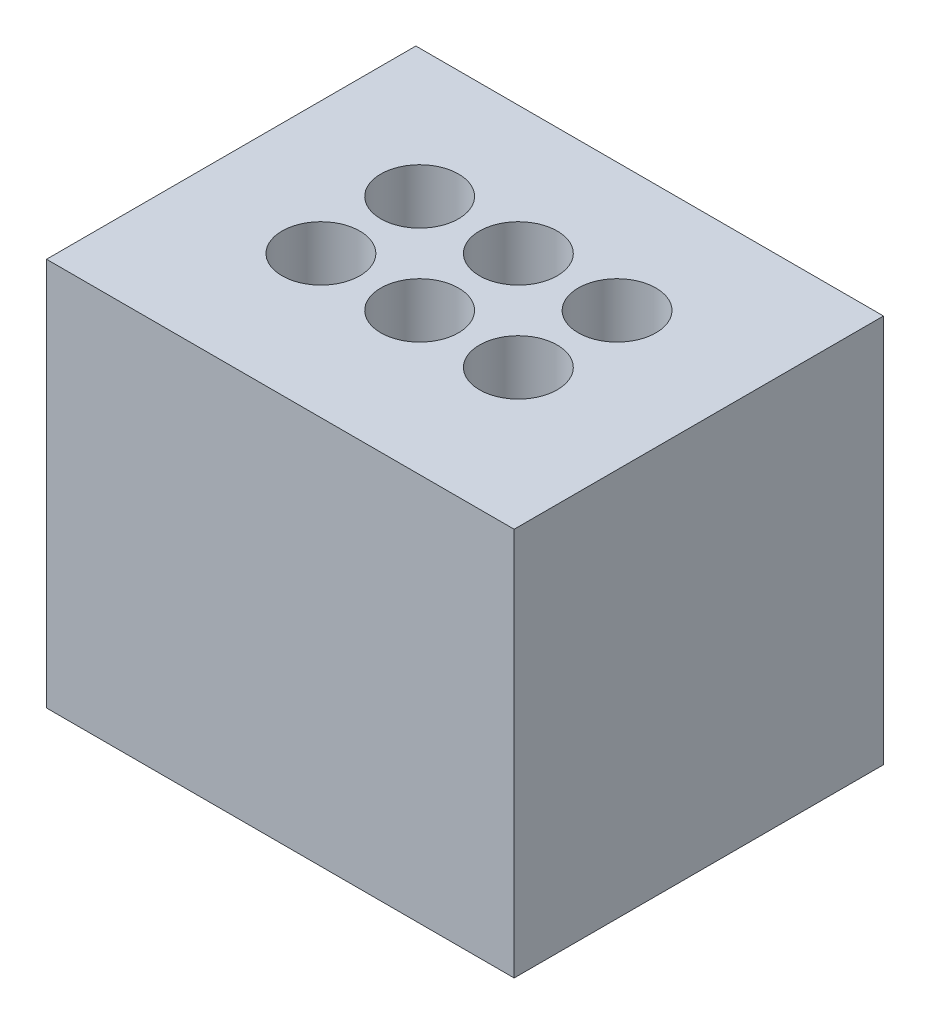
ISO-10303-21;
HEADER;
FILE_DESCRIPTION(('STEP AP214'),'2;1');
FILE_NAME('part.step','',(''),(''),'','','');
FILE_SCHEMA(('AUTOMOTIVE_DESIGN { 1 0 10303 214 1 1 1 1 }'));
ENDSEC;
DATA;
#1=APPLICATION_CONTEXT('core data for automotive mechanical design processes');
#2=APPLICATION_PROTOCOL_DEFINITION('international standard','automotive_design',2000,#1);
#3=PRODUCT_CONTEXT('',#1,'mechanical');
#4=PRODUCT('Part','Part','',(#3));
#5=PRODUCT_RELATED_PRODUCT_CATEGORY('part','',(#4));
#6=PRODUCT_DEFINITION_FORMATION('','',#4);
#7=PRODUCT_DEFINITION_CONTEXT('part definition',#1,'design');
#8=PRODUCT_DEFINITION('design','',#6,#7);
#9=PRODUCT_DEFINITION_SHAPE('','',#8);
#10=(LENGTH_UNIT() NAMED_UNIT(*) SI_UNIT(.MILLI.,.METRE.));
#11=(NAMED_UNIT(*) PLANE_ANGLE_UNIT() SI_UNIT($,.RADIAN.));
#12=(NAMED_UNIT(*) SI_UNIT($,.STERADIAN.) SOLID_ANGLE_UNIT());
#13=UNCERTAINTY_MEASURE_WITH_UNIT(LENGTH_MEASURE(1.E-05),#10,'distance_accuracy_value','');
#14=(GEOMETRIC_REPRESENTATION_CONTEXT(3) GLOBAL_UNCERTAINTY_ASSIGNED_CONTEXT((#13)) GLOBAL_UNIT_ASSIGNED_CONTEXT((#10,
#11,#12)) REPRESENTATION_CONTEXT('',''));
#15=CARTESIAN_POINT('',(0.,0.,0.));
#16=DIRECTION('',(0.,0.,1.));
#17=DIRECTION('',(1.,0.,0.));
#18=AXIS2_PLACEMENT_3D('',#15,#16,#17);
#19=CARTESIAN_POINT('',(0.,10.,0.));
#20=DIRECTION('',(0.,1.,0.));
#21=DIRECTION('',(0.,0.,1.));
#22=AXIS2_PLACEMENT_3D('',#19,#20,#21);
#23=PLANE('',#22);
#24=CARTESIAN_POINT('',(17.8208556768669,10.,-12.9265911009987));
#25=DIRECTION('',(0.,1.,0.));
#26=DIRECTION('',(0.,0.,1.));
#27=AXIS2_PLACEMENT_3D('',#24,#25,#26);
#28=CIRCLE('',#27,1.);
#29=CARTESIAN_POINT('',(17.8208556768669,10.,-11.9265911009987));
#30=VERTEX_POINT('',#29);
#31=EDGE_CURVE('E133',#30,#30,#28,.T.);
#32=ORIENTED_EDGE('',*,*,#31,.F.);
#33=EDGE_LOOP('',(#32));
#34=FACE_BOUND('',#33,.T.);
#35=CARTESIAN_POINT('',(20.360855676867,10.,-10.3865911009987));
#36=DIRECTION('',(0.,1.,0.));
#37=DIRECTION('',(0.,0.,1.));
#38=AXIS2_PLACEMENT_3D('',#35,#36,#37);
#39=CIRCLE('',#38,1.);
#40=CARTESIAN_POINT('',(20.360855676867,10.,-9.38659110099869));
#41=VERTEX_POINT('',#40);
#42=EDGE_CURVE('E121',#41,#41,#39,.T.);
#43=ORIENTED_EDGE('',*,*,#42,.F.);
#44=EDGE_LOOP('',(#43));
#45=FACE_BOUND('',#44,.T.);
#46=CARTESIAN_POINT('',(15.280855676867,10.,-10.3865911009987));
#47=DIRECTION('',(0.,1.,0.));
#48=DIRECTION('',(0.,0.,1.));
#49=AXIS2_PLACEMENT_3D('',#46,#47,#48);
#50=CIRCLE('',#49,1.);
#51=CARTESIAN_POINT('',(15.280855676867,10.,-9.38659110099869));
#52=VERTEX_POINT('',#51);
#53=EDGE_CURVE('E100',#52,#52,#50,.T.);
#54=ORIENTED_EDGE('',*,*,#53,.F.);
#55=EDGE_LOOP('',(#54));
#56=FACE_BOUND('',#55,.T.);
#57=DIRECTION('',(0.,0.,1.));
#58=VECTOR('',#57,1.);
#59=CARTESIAN_POINT('',(11.8802985663251,10.,-16.229676856771));
#60=LINE('',#59,#58);
#61=CARTESIAN_POINT('',(11.8802985663251,10.,-16.229676856771));
#62=VERTEX_POINT('',#61);
#63=CARTESIAN_POINT('',(11.8802985663251,10.,-6.72663628694349));
#64=VERTEX_POINT('',#63);
#65=EDGE_CURVE('E85',#62,#64,#60,.T.);
#66=ORIENTED_EDGE('',*,*,#65,.T.);
#67=DIRECTION('',(1.,0.,0.));
#68=VECTOR('',#67,1.);
#69=CARTESIAN_POINT('',(11.8802985663251,10.,-6.72663628694349));
#70=LINE('',#69,#68);
#71=CARTESIAN_POINT('',(23.9122387646944,10.,-6.72663628694349));
#72=VERTEX_POINT('',#71);
#73=EDGE_CURVE('E80',#64,#72,#70,.T.);
#74=ORIENTED_EDGE('',*,*,#73,.T.);
#75=DIRECTION('',(0.,0.,-1.));
#76=VECTOR('',#75,1.);
#77=CARTESIAN_POINT('',(23.9122387646944,10.,-16.229676856771));
#78=LINE('',#77,#76);
#79=CARTESIAN_POINT('',(23.9122387646944,10.,-16.229676856771));
#80=VERTEX_POINT('',#79);
#81=EDGE_CURVE('E83',#72,#80,#78,.T.);
#82=ORIENTED_EDGE('',*,*,#81,.T.);
#83=DIRECTION('',(-1.,0.,0.));
#84=VECTOR('',#83,1.);
#85=CARTESIAN_POINT('',(11.8802985663251,10.,-16.229676856771));
#86=LINE('',#85,#84);
#87=EDGE_CURVE('E50',#80,#62,#86,.T.);
#88=ORIENTED_EDGE('',*,*,#87,.T.);
#89=EDGE_LOOP('',(#66,#74,#82,#88));
#90=FACE_BOUND('',#89,.T.);
#91=CARTESIAN_POINT('',(17.820855676867,10.,-10.3865911009987));
#92=DIRECTION('',(0.,1.,0.));
#93=DIRECTION('',(0.,0.,1.));
#94=AXIS2_PLACEMENT_3D('',#91,#92,#93);
#95=CIRCLE('',#94,1.);
#96=CARTESIAN_POINT('',(17.820855676867,10.,-9.38659110099869));
#97=VERTEX_POINT('',#96);
#98=EDGE_CURVE('E115',#97,#97,#95,.T.);
#99=ORIENTED_EDGE('',*,*,#98,.F.);
#100=EDGE_LOOP('',(#99));
#101=FACE_BOUND('',#100,.T.);
#102=CARTESIAN_POINT('',(15.2808556768669,10.,-12.9265911009987));
#103=DIRECTION('',(0.,1.,0.));
#104=DIRECTION('',(0.,0.,1.));
#105=AXIS2_PLACEMENT_3D('',#102,#103,#104);
#106=CIRCLE('',#105,1.);
#107=CARTESIAN_POINT('',(15.2808556768669,10.,-11.9265911009987));
#108=VERTEX_POINT('',#107);
#109=EDGE_CURVE('E127',#108,#108,#106,.T.);
#110=ORIENTED_EDGE('',*,*,#109,.F.);
#111=EDGE_LOOP('',(#110));
#112=FACE_BOUND('',#111,.T.);
#113=CARTESIAN_POINT('',(20.3608556768669,10.,-12.9265911009987));
#114=DIRECTION('',(0.,1.,0.));
#115=DIRECTION('',(0.,0.,1.));
#116=AXIS2_PLACEMENT_3D('',#113,#114,#115);
#117=CIRCLE('',#116,1.);
#118=CARTESIAN_POINT('',(20.3608556768669,10.,-11.9265911009987));
#119=VERTEX_POINT('',#118);
#120=EDGE_CURVE('E139',#119,#119,#117,.T.);
#121=ORIENTED_EDGE('',*,*,#120,.F.);
#122=EDGE_LOOP('',(#121));
#123=FACE_BOUND('',#122,.T.);
#124=ADVANCED_FACE('F33',(#34,#45,#56,#90,#101,#112,#123),#23,.T.);
#125=CARTESIAN_POINT('',(0.,0.,0.));
#126=DIRECTION('',(0.,1.,0.));
#127=DIRECTION('',(0.,0.,1.));
#128=AXIS2_PLACEMENT_3D('',#125,#126,#127);
#129=PLANE('',#128);
#130=DIRECTION('',(0.,0.,1.));
#131=VECTOR('',#130,1.);
#132=CARTESIAN_POINT('',(11.8802985663251,0.,-16.229676856771));
#133=LINE('',#132,#131);
#134=CARTESIAN_POINT('',(11.8802985663251,0.,-16.229676856771));
#135=VERTEX_POINT('',#134);
#136=CARTESIAN_POINT('',(11.8802985663251,0.,-6.72663628694349));
#137=VERTEX_POINT('',#136);
#138=EDGE_CURVE('E97',#135,#137,#133,.T.);
#139=ORIENTED_EDGE('',*,*,#138,.F.);
#140=DIRECTION('',(-1.,0.,0.));
#141=VECTOR('',#140,1.);
#142=CARTESIAN_POINT('',(11.8802985663251,0.,-16.229676856771));
#143=LINE('',#142,#141);
#144=CARTESIAN_POINT('',(23.9122387646944,0.,-16.229676856771));
#145=VERTEX_POINT('',#144);
#146=EDGE_CURVE('E73',#145,#135,#143,.T.);
#147=ORIENTED_EDGE('',*,*,#146,.F.);
#148=DIRECTION('',(0.,0.,-1.));
#149=VECTOR('',#148,1.);
#150=CARTESIAN_POINT('',(23.9122387646944,0.,-16.229676856771));
#151=LINE('',#150,#149);
#152=CARTESIAN_POINT('',(23.9122387646944,0.,-6.72663628694349));
#153=VERTEX_POINT('',#152);
#154=EDGE_CURVE('E67',#153,#145,#151,.T.);
#155=ORIENTED_EDGE('',*,*,#154,.F.);
#156=DIRECTION('',(1.,0.,0.));
#157=VECTOR('',#156,1.);
#158=CARTESIAN_POINT('',(11.8802985663251,0.,-6.72663628694349));
#159=LINE('',#158,#157);
#160=EDGE_CURVE('E89',#137,#153,#159,.T.);
#161=ORIENTED_EDGE('',*,*,#160,.F.);
#162=EDGE_LOOP('',(#139,#147,#155,#161));
#163=FACE_BOUND('',#162,.T.);
#164=CARTESIAN_POINT('',(15.280855676867,0.,-10.3865911009987));
#165=DIRECTION('',(0.,1.,0.));
#166=DIRECTION('',(0.,0.,1.));
#167=AXIS2_PLACEMENT_3D('',#164,#165,#166);
#168=CIRCLE('',#167,1.);
#169=CARTESIAN_POINT('',(15.280855676867,0.,-9.38659110099869));
#170=VERTEX_POINT('',#169);
#171=EDGE_CURVE('E112',#170,#170,#168,.T.);
#172=ORIENTED_EDGE('',*,*,#171,.T.);
#173=EDGE_LOOP('',(#172));
#174=FACE_BOUND('',#173,.T.);
#175=CARTESIAN_POINT('',(17.820855676867,0.,-10.3865911009987));
#176=DIRECTION('',(0.,1.,0.));
#177=DIRECTION('',(0.,0.,1.));
#178=AXIS2_PLACEMENT_3D('',#175,#176,#177);
#179=CIRCLE('',#178,1.);
#180=CARTESIAN_POINT('',(17.820855676867,0.,-9.38659110099869));
#181=VERTEX_POINT('',#180);
#182=EDGE_CURVE('E118',#181,#181,#179,.T.);
#183=ORIENTED_EDGE('',*,*,#182,.T.);
#184=EDGE_LOOP('',(#183));
#185=FACE_BOUND('',#184,.T.);
#186=CARTESIAN_POINT('',(20.360855676867,0.,-10.3865911009987));
#187=DIRECTION('',(0.,1.,0.));
#188=DIRECTION('',(0.,0.,1.));
#189=AXIS2_PLACEMENT_3D('',#186,#187,#188);
#190=CIRCLE('',#189,1.);
#191=CARTESIAN_POINT('',(20.360855676867,0.,-9.38659110099869));
#192=VERTEX_POINT('',#191);
#193=EDGE_CURVE('E124',#192,#192,#190,.T.);
#194=ORIENTED_EDGE('',*,*,#193,.T.);
#195=EDGE_LOOP('',(#194));
#196=FACE_BOUND('',#195,.T.);
#197=CARTESIAN_POINT('',(15.2808556768669,0.,-12.9265911009987));
#198=DIRECTION('',(0.,1.,0.));
#199=DIRECTION('',(0.,0.,1.));
#200=AXIS2_PLACEMENT_3D('',#197,#198,#199);
#201=CIRCLE('',#200,1.);
#202=CARTESIAN_POINT('',(15.2808556768669,0.,-11.9265911009987));
#203=VERTEX_POINT('',#202);
#204=EDGE_CURVE('E130',#203,#203,#201,.T.);
#205=ORIENTED_EDGE('',*,*,#204,.T.);
#206=EDGE_LOOP('',(#205));
#207=FACE_BOUND('',#206,.T.);
#208=CARTESIAN_POINT('',(17.8208556768669,0.,-12.9265911009987));
#209=DIRECTION('',(0.,1.,0.));
#210=DIRECTION('',(0.,0.,1.));
#211=AXIS2_PLACEMENT_3D('',#208,#209,#210);
#212=CIRCLE('',#211,1.);
#213=CARTESIAN_POINT('',(17.8208556768669,0.,-11.9265911009987));
#214=VERTEX_POINT('',#213);
#215=EDGE_CURVE('E136',#214,#214,#212,.T.);
#216=ORIENTED_EDGE('',*,*,#215,.T.);
#217=EDGE_LOOP('',(#216));
#218=FACE_BOUND('',#217,.T.);
#219=CARTESIAN_POINT('',(20.3608556768669,0.,-12.9265911009987));
#220=DIRECTION('',(0.,1.,0.));
#221=DIRECTION('',(0.,0.,1.));
#222=AXIS2_PLACEMENT_3D('',#219,#220,#221);
#223=CIRCLE('',#222,1.);
#224=CARTESIAN_POINT('',(20.3608556768669,0.,-11.9265911009987));
#225=VERTEX_POINT('',#224);
#226=EDGE_CURVE('E142',#225,#225,#223,.T.);
#227=ORIENTED_EDGE('',*,*,#226,.T.);
#228=EDGE_LOOP('',(#227));
#229=FACE_BOUND('',#228,.T.);
#230=ADVANCED_FACE('F108',(#163,#174,#185,#196,#207,#218,#229),#129,.F.);
#231=CARTESIAN_POINT('',(11.8802985663251,10.,-16.229676856771));
#232=DIRECTION('',(1.,0.,0.));
#233=DIRECTION('',(0.,0.,-1.));
#234=AXIS2_PLACEMENT_3D('',#231,#232,#233);
#235=PLANE('',#234);
#236=ORIENTED_EDGE('',*,*,#138,.T.);
#237=DIRECTION('',(0.,-1.,0.));
#238=VECTOR('',#237,1.);
#239=CARTESIAN_POINT('',(11.8802985663251,10.,-6.72663628694349));
#240=LINE('',#239,#238);
#241=EDGE_CURVE('E11',#64,#137,#240,.T.);
#242=ORIENTED_EDGE('',*,*,#241,.F.);
#243=ORIENTED_EDGE('',*,*,#65,.F.);
#244=DIRECTION('',(0.,-1.,0.));
#245=VECTOR('',#244,1.);
#246=CARTESIAN_POINT('',(11.8802985663251,10.,-16.229676856771));
#247=LINE('',#246,#245);
#248=EDGE_CURVE('E93',#62,#135,#247,.T.);
#249=ORIENTED_EDGE('',*,*,#248,.T.);
#250=EDGE_LOOP('',(#236,#242,#243,#249));
#251=FACE_BOUND('',#250,.T.);
#252=ADVANCED_FACE('F35',(#251),#235,.F.);
#253=CARTESIAN_POINT('',(11.8802985663251,10.,-6.72663628694349));
#254=DIRECTION('',(0.,0.,-1.));
#255=DIRECTION('',(-1.,0.,0.));
#256=AXIS2_PLACEMENT_3D('',#253,#254,#255);
#257=PLANE('',#256);
#258=ORIENTED_EDGE('',*,*,#160,.T.);
#259=DIRECTION('',(0.,-1.,0.));
#260=VECTOR('',#259,1.);
#261=CARTESIAN_POINT('',(23.9122387646944,10.,-6.72663628694349));
#262=LINE('',#261,#260);
#263=EDGE_CURVE('E42',#72,#153,#262,.T.);
#264=ORIENTED_EDGE('',*,*,#263,.F.);
#265=ORIENTED_EDGE('',*,*,#73,.F.);
#266=ORIENTED_EDGE('',*,*,#241,.T.);
#267=EDGE_LOOP('',(#258,#264,#265,#266));
#268=FACE_BOUND('',#267,.T.);
#269=ADVANCED_FACE('F88',(#268),#257,.F.);
#270=CARTESIAN_POINT('',(23.9122387646944,10.,-16.229676856771));
#271=DIRECTION('',(-1.,0.,0.));
#272=DIRECTION('',(0.,0.,1.));
#273=AXIS2_PLACEMENT_3D('',#270,#271,#272);
#274=PLANE('',#273);
#275=ORIENTED_EDGE('',*,*,#154,.T.);
#276=DIRECTION('',(0.,-1.,0.));
#277=VECTOR('',#276,1.);
#278=CARTESIAN_POINT('',(23.9122387646944,10.,-16.229676856771));
#279=LINE('',#278,#277);
#280=EDGE_CURVE('E90',#80,#145,#279,.T.);
#281=ORIENTED_EDGE('',*,*,#280,.F.);
#282=ORIENTED_EDGE('',*,*,#81,.F.);
#283=ORIENTED_EDGE('',*,*,#263,.T.);
#284=EDGE_LOOP('',(#275,#281,#282,#283));
#285=FACE_BOUND('',#284,.T.);
#286=ADVANCED_FACE('F91',(#285),#274,.F.);
#287=CARTESIAN_POINT('',(11.8802985663251,10.,-16.229676856771));
#288=DIRECTION('',(0.,0.,1.));
#289=DIRECTION('',(1.,0.,0.));
#290=AXIS2_PLACEMENT_3D('',#287,#288,#289);
#291=PLANE('',#290);
#292=ORIENTED_EDGE('',*,*,#146,.T.);
#293=ORIENTED_EDGE('',*,*,#248,.F.);
#294=ORIENTED_EDGE('',*,*,#87,.F.);
#295=ORIENTED_EDGE('',*,*,#280,.T.);
#296=EDGE_LOOP('',(#292,#293,#294,#295));
#297=FACE_BOUND('',#296,.T.);
#298=ADVANCED_FACE('F105',(#297),#291,.F.);
#299=CARTESIAN_POINT('',(15.280855676867,10.,-10.3865911009987));
#300=DIRECTION('',(0.,-1.,0.));
#301=DIRECTION('',(0.,0.,-1.));
#302=AXIS2_PLACEMENT_3D('',#299,#300,#301);
#303=CYLINDRICAL_SURFACE('',#302,1.);
#304=ORIENTED_EDGE('',*,*,#53,.T.);
#305=EDGE_LOOP('',(#304));
#306=FACE_BOUND('',#305,.T.);
#307=ORIENTED_EDGE('',*,*,#171,.F.);
#308=EDGE_LOOP('',(#307));
#309=FACE_BOUND('',#308,.T.);
#310=ADVANCED_FACE('F161',(#306,#309),#303,.F.);
#311=CARTESIAN_POINT('',(17.820855676867,10.,-10.3865911009987));
#312=DIRECTION('',(0.,-1.,0.));
#313=DIRECTION('',(0.,0.,-1.));
#314=AXIS2_PLACEMENT_3D('',#311,#312,#313);
#315=CYLINDRICAL_SURFACE('',#314,1.);
#316=ORIENTED_EDGE('',*,*,#98,.T.);
#317=EDGE_LOOP('',(#316));
#318=FACE_BOUND('',#317,.T.);
#319=ORIENTED_EDGE('',*,*,#182,.F.);
#320=EDGE_LOOP('',(#319));
#321=FACE_BOUND('',#320,.T.);
#322=ADVANCED_FACE('F207',(#318,#321),#315,.F.);
#323=CARTESIAN_POINT('',(20.360855676867,10.,-10.3865911009987));
#324=DIRECTION('',(0.,-1.,0.));
#325=DIRECTION('',(0.,0.,-1.));
#326=AXIS2_PLACEMENT_3D('',#323,#324,#325);
#327=CYLINDRICAL_SURFACE('',#326,1.);
#328=ORIENTED_EDGE('',*,*,#42,.T.);
#329=EDGE_LOOP('',(#328));
#330=FACE_BOUND('',#329,.T.);
#331=ORIENTED_EDGE('',*,*,#193,.F.);
#332=EDGE_LOOP('',(#331));
#333=FACE_BOUND('',#332,.T.);
#334=ADVANCED_FACE('F215',(#330,#333),#327,.F.);
#335=CARTESIAN_POINT('',(15.2808556768669,10.,-12.9265911009987));
#336=DIRECTION('',(0.,-1.,0.));
#337=DIRECTION('',(0.,0.,-1.));
#338=AXIS2_PLACEMENT_3D('',#335,#336,#337);
#339=CYLINDRICAL_SURFACE('',#338,1.);
#340=ORIENTED_EDGE('',*,*,#109,.T.);
#341=EDGE_LOOP('',(#340));
#342=FACE_BOUND('',#341,.T.);
#343=ORIENTED_EDGE('',*,*,#204,.F.);
#344=EDGE_LOOP('',(#343));
#345=FACE_BOUND('',#344,.T.);
#346=ADVANCED_FACE('F223',(#342,#345),#339,.F.);
#347=CARTESIAN_POINT('',(17.8208556768669,10.,-12.9265911009987));
#348=DIRECTION('',(0.,-1.,0.));
#349=DIRECTION('',(0.,0.,-1.));
#350=AXIS2_PLACEMENT_3D('',#347,#348,#349);
#351=CYLINDRICAL_SURFACE('',#350,1.);
#352=ORIENTED_EDGE('',*,*,#31,.T.);
#353=EDGE_LOOP('',(#352));
#354=FACE_BOUND('',#353,.T.);
#355=ORIENTED_EDGE('',*,*,#215,.F.);
#356=EDGE_LOOP('',(#355));
#357=FACE_BOUND('',#356,.T.);
#358=ADVANCED_FACE('F232',(#354,#357),#351,.F.);
#359=CARTESIAN_POINT('',(20.3608556768669,10.,-12.9265911009987));
#360=DIRECTION('',(0.,-1.,0.));
#361=DIRECTION('',(0.,0.,-1.));
#362=AXIS2_PLACEMENT_3D('',#359,#360,#361);
#363=CYLINDRICAL_SURFACE('',#362,1.);
#364=ORIENTED_EDGE('',*,*,#120,.T.);
#365=EDGE_LOOP('',(#364));
#366=FACE_BOUND('',#365,.T.);
#367=ORIENTED_EDGE('',*,*,#226,.F.);
#368=EDGE_LOOP('',(#367));
#369=FACE_BOUND('',#368,.T.);
#370=ADVANCED_FACE('F148',(#366,#369),#363,.F.);
#371=CLOSED_SHELL('',(#124,#230,#252,#269,#286,#298,#310,#322,#334,#346,#358,#370));
#372=MANIFOLD_SOLID_BREP('B2',#371);
#373=ADVANCED_BREP_SHAPE_REPRESENTATION('',(#18,#372),#14);
#374=SHAPE_DEFINITION_REPRESENTATION(#9,#373);
ENDSEC;
END-ISO-10303-21;
